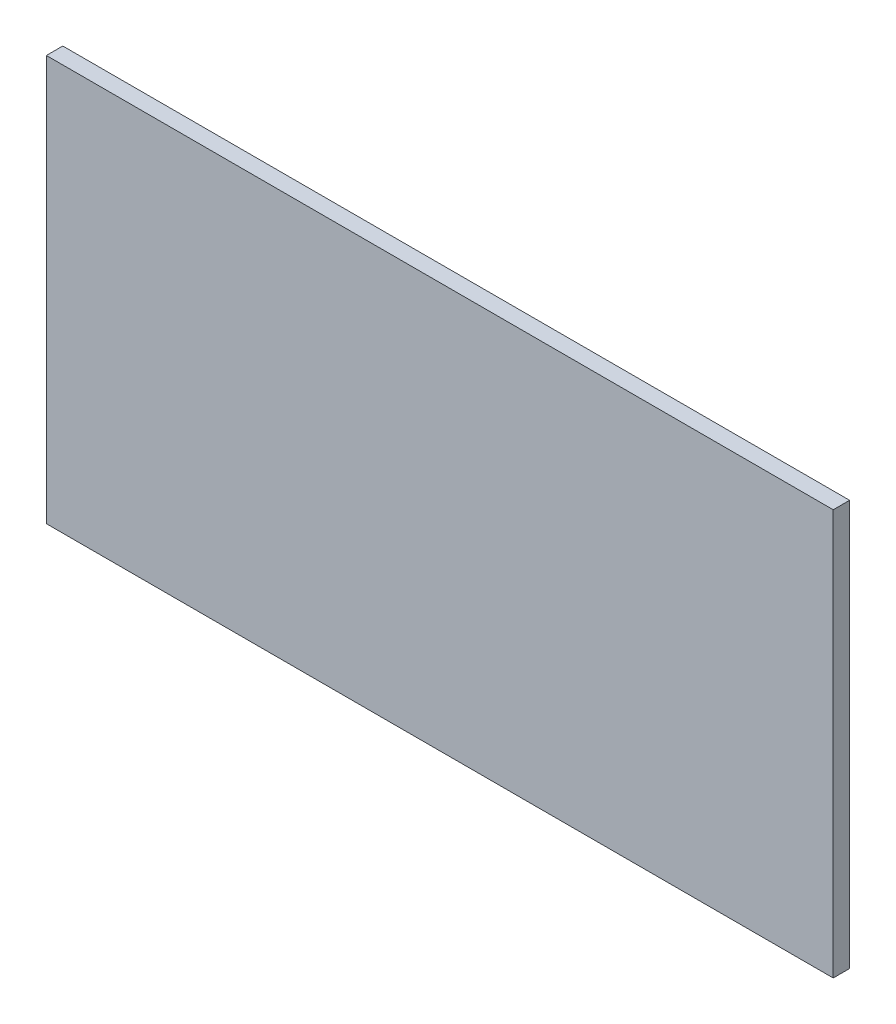
ISO-10303-21;
HEADER;
FILE_DESCRIPTION(('STEP AP214'),'2;1');
FILE_NAME('part.step','',(''),(''),'','','');
FILE_SCHEMA(('AUTOMOTIVE_DESIGN { 1 0 10303 214 1 1 1 1 }'));
ENDSEC;
DATA;
#1=APPLICATION_CONTEXT('core data for automotive mechanical design processes');
#2=APPLICATION_PROTOCOL_DEFINITION('international standard','automotive_design',2000,#1);
#3=PRODUCT_CONTEXT('',#1,'mechanical');
#4=PRODUCT('Part','Part','',(#3));
#5=PRODUCT_RELATED_PRODUCT_CATEGORY('part','',(#4));
#6=PRODUCT_DEFINITION_FORMATION('','',#4);
#7=PRODUCT_DEFINITION_CONTEXT('part definition',#1,'design');
#8=PRODUCT_DEFINITION('design','',#6,#7);
#9=PRODUCT_DEFINITION_SHAPE('','',#8);
#10=(LENGTH_UNIT() NAMED_UNIT(*) SI_UNIT(.MILLI.,.METRE.));
#11=(NAMED_UNIT(*) PLANE_ANGLE_UNIT() SI_UNIT($,.RADIAN.));
#12=(NAMED_UNIT(*) SI_UNIT($,.STERADIAN.) SOLID_ANGLE_UNIT());
#13=UNCERTAINTY_MEASURE_WITH_UNIT(LENGTH_MEASURE(1.E-05),#10,'distance_accuracy_value','');
#14=(GEOMETRIC_REPRESENTATION_CONTEXT(3) GLOBAL_UNCERTAINTY_ASSIGNED_CONTEXT((#13)) GLOBAL_UNIT_ASSIGNED_CONTEXT((#10,
#11,#12)) REPRESENTATION_CONTEXT('',''));
#15=CARTESIAN_POINT('',(0.,0.,0.));
#16=DIRECTION('',(0.,0.,1.));
#17=DIRECTION('',(1.,0.,0.));
#18=AXIS2_PLACEMENT_3D('',#15,#16,#17);
#19=CARTESIAN_POINT('',(304.8,-157.090324336033,-12.7));
#20=DIRECTION('',(1.,0.,0.));
#21=DIRECTION('',(0.,0.,-1.));
#22=AXIS2_PLACEMENT_3D('',#19,#20,#21);
#23=PLANE('',#22);
#24=DIRECTION('',(0.,1.,0.));
#25=VECTOR('',#24,1.);
#26=CARTESIAN_POINT('',(304.8,-157.090324336033,0.));
#27=LINE('',#26,#25);
#28=CARTESIAN_POINT('',(304.8,-157.090324336033,0.));
#29=VERTEX_POINT('',#28);
#30=CARTESIAN_POINT('',(304.8,157.090324336033,0.));
#31=VERTEX_POINT('',#30);
#32=EDGE_CURVE('E146',#29,#31,#27,.T.);
#33=ORIENTED_EDGE('',*,*,#32,.F.);
#34=DIRECTION('',(0.,0.,1.));
#35=VECTOR('',#34,1.);
#36=CARTESIAN_POINT('',(304.8,-157.090324336033,-12.7));
#37=LINE('',#36,#35);
#38=CARTESIAN_POINT('',(304.8,-157.090324336033,-12.7));
#39=VERTEX_POINT('',#38);
#40=EDGE_CURVE('E12',#39,#29,#37,.T.);
#41=ORIENTED_EDGE('',*,*,#40,.F.);
#42=DIRECTION('',(0.,1.,0.));
#43=VECTOR('',#42,1.);
#44=CARTESIAN_POINT('',(304.8,-157.090324336033,-12.7));
#45=LINE('',#44,#43);
#46=CARTESIAN_POINT('',(304.8,157.090324336033,-12.7));
#47=VERTEX_POINT('',#46);
#48=EDGE_CURVE('E152',#39,#47,#45,.T.);
#49=ORIENTED_EDGE('',*,*,#48,.T.);
#50=DIRECTION('',(0.,0.,1.));
#51=VECTOR('',#50,1.);
#52=CARTESIAN_POINT('',(304.8,157.090324336033,-12.7));
#53=LINE('',#52,#51);
#54=EDGE_CURVE('E135',#47,#31,#53,.T.);
#55=ORIENTED_EDGE('',*,*,#54,.T.);
#56=EDGE_LOOP('',(#33,#41,#49,#55));
#57=FACE_BOUND('',#56,.T.);
#58=ADVANCED_FACE('F66',(#57),#23,.T.);
#59=CARTESIAN_POINT('',(-304.8,-157.090324336033,-12.7));
#60=DIRECTION('',(0.,-1.,0.));
#61=DIRECTION('',(0.,0.,-1.));
#62=AXIS2_PLACEMENT_3D('',#59,#60,#61);
#63=PLANE('',#62);
#64=DIRECTION('',(1.,0.,0.));
#65=VECTOR('',#64,1.);
#66=CARTESIAN_POINT('',(-304.8,-157.090324336033,0.));
#67=LINE('',#66,#65);
#68=CARTESIAN_POINT('',(-304.8,-157.090324336033,0.));
#69=VERTEX_POINT('',#68);
#70=EDGE_CURVE('E143',#69,#29,#67,.T.);
#71=ORIENTED_EDGE('',*,*,#70,.F.);
#72=DIRECTION('',(0.,0.,1.));
#73=VECTOR('',#72,1.);
#74=CARTESIAN_POINT('',(-304.8,-157.090324336033,-12.7));
#75=LINE('',#74,#73);
#76=CARTESIAN_POINT('',(-304.8,-157.090324336033,-12.7));
#77=VERTEX_POINT('',#76);
#78=EDGE_CURVE('E74',#77,#69,#75,.T.);
#79=ORIENTED_EDGE('',*,*,#78,.F.);
#80=DIRECTION('',(1.,0.,0.));
#81=VECTOR('',#80,1.);
#82=CARTESIAN_POINT('',(-304.8,-157.090324336033,-12.7));
#83=LINE('',#82,#81);
#84=EDGE_CURVE('E69',#77,#39,#83,.T.);
#85=ORIENTED_EDGE('',*,*,#84,.T.);
#86=ORIENTED_EDGE('',*,*,#40,.T.);
#87=EDGE_LOOP('',(#71,#79,#85,#86));
#88=FACE_BOUND('',#87,.T.);
#89=ADVANCED_FACE('F217',(#88),#63,.T.);
#90=CARTESIAN_POINT('',(-304.8,-157.090324336033,-12.7));
#91=DIRECTION('',(-1.,0.,0.));
#92=DIRECTION('',(0.,0.,1.));
#93=AXIS2_PLACEMENT_3D('',#90,#91,#92);
#94=PLANE('',#93);
#95=DIRECTION('',(0.,-1.,0.));
#96=VECTOR('',#95,1.);
#97=CARTESIAN_POINT('',(-304.8,-157.090324336033,0.));
#98=LINE('',#97,#96);
#99=CARTESIAN_POINT('',(-304.8,157.090324336033,0.));
#100=VERTEX_POINT('',#99);
#101=EDGE_CURVE('E138',#100,#69,#98,.T.);
#102=ORIENTED_EDGE('',*,*,#101,.F.);
#103=DIRECTION('',(0.,0.,1.));
#104=VECTOR('',#103,1.);
#105=CARTESIAN_POINT('',(-304.8,157.090324336033,-12.7));
#106=LINE('',#105,#104);
#107=CARTESIAN_POINT('',(-304.8,157.090324336033,-12.7));
#108=VERTEX_POINT('',#107);
#109=EDGE_CURVE('E125',#108,#100,#106,.T.);
#110=ORIENTED_EDGE('',*,*,#109,.F.);
#111=DIRECTION('',(0.,1.,0.));
#112=VECTOR('',#111,1.);
#113=CARTESIAN_POINT('',(-304.8,-157.090324336033,-12.7));
#114=LINE('',#113,#112);
#115=EDGE_CURVE('E156',#108,#77,#114,.F.);
#116=ORIENTED_EDGE('',*,*,#115,.T.);
#117=ORIENTED_EDGE('',*,*,#78,.T.);
#118=EDGE_LOOP('',(#102,#110,#116,#117));
#119=FACE_BOUND('',#118,.T.);
#120=ADVANCED_FACE('F139',(#119),#94,.T.);
#121=CARTESIAN_POINT('',(-304.8,157.090324336033,-12.7));
#122=DIRECTION('',(0.,1.,0.));
#123=DIRECTION('',(0.,0.,1.));
#124=AXIS2_PLACEMENT_3D('',#121,#122,#123);
#125=PLANE('',#124);
#126=DIRECTION('',(-1.,0.,0.));
#127=VECTOR('',#126,1.);
#128=CARTESIAN_POINT('',(-304.8,157.090324336033,0.));
#129=LINE('',#128,#127);
#130=EDGE_CURVE('E130',#31,#100,#129,.T.);
#131=ORIENTED_EDGE('',*,*,#130,.F.);
#132=ORIENTED_EDGE('',*,*,#54,.F.);
#133=DIRECTION('',(1.,0.,0.));
#134=VECTOR('',#133,1.);
#135=CARTESIAN_POINT('',(-304.8,157.090324336033,-12.7));
#136=LINE('',#135,#134);
#137=EDGE_CURVE('E132',#47,#108,#136,.F.);
#138=ORIENTED_EDGE('',*,*,#137,.T.);
#139=ORIENTED_EDGE('',*,*,#109,.T.);
#140=EDGE_LOOP('',(#131,#132,#138,#139));
#141=FACE_BOUND('',#140,.T.);
#142=ADVANCED_FACE('F127',(#141),#125,.T.);
#143=CARTESIAN_POINT('',(0.,0.,0.));
#144=DIRECTION('',(0.,0.,-1.));
#145=DIRECTION('',(-1.,0.,0.));
#146=AXIS2_PLACEMENT_3D('',#143,#144,#145);
#147=PLANE('',#146);
#148=ORIENTED_EDGE('',*,*,#32,.T.);
#149=ORIENTED_EDGE('',*,*,#130,.T.);
#150=ORIENTED_EDGE('',*,*,#101,.T.);
#151=ORIENTED_EDGE('',*,*,#70,.T.);
#152=EDGE_LOOP('',(#148,#149,#150,#151));
#153=FACE_BOUND('',#152,.T.);
#154=ADVANCED_FACE('F145',(#153),#147,.F.);
#155=CARTESIAN_POINT('',(0.,0.,-38.1));
#156=DIRECTION('',(0.,0.,1.));
#157=DIRECTION('',(1.,0.,0.));
#158=AXIS2_PLACEMENT_3D('',#155,#156,#157);
#159=PLANE('',#158);
#160=CARTESIAN_POINT('',(0.,0.,-38.1));
#161=DIRECTION('',(0.,0.,1.));
#162=DIRECTION('',(1.,0.,0.));
#163=AXIS2_PLACEMENT_3D('',#160,#161,#162);
#164=CIRCLE('',#163,88.9);
#165=CARTESIAN_POINT('',(-79.0222222222222,40.7271211241567,-38.1));
#166=VERTEX_POINT('',#165);
#167=CARTESIAN_POINT('',(-79.0222222222222,-40.7271211241566,-38.1));
#168=VERTEX_POINT('',#167);
#169=EDGE_CURVE('E165',#166,#168,#164,.T.);
#170=ORIENTED_EDGE('',*,*,#169,.F.);
#171=CARTESIAN_POINT('',(79.0222222222222,40.7271211241566,-38.1));
#172=VERTEX_POINT('',#171);
#173=EDGE_CURVE('E286',#172,#166,#164,.T.);
#174=ORIENTED_EDGE('',*,*,#173,.F.);
#175=CARTESIAN_POINT('',(79.0222222222222,-40.7271211241567,-38.1));
#176=VERTEX_POINT('',#175);
#177=EDGE_CURVE('E113',#176,#172,#164,.T.);
#178=ORIENTED_EDGE('',*,*,#177,.F.);
#179=EDGE_CURVE('E170',#168,#176,#164,.T.);
#180=ORIENTED_EDGE('',*,*,#179,.F.);
#181=EDGE_LOOP('',(#170,#174,#178,#180));
#182=FACE_BOUND('',#181,.T.);
#183=ADVANCED_FACE('F216',(#182),#159,.F.);
#184=CARTESIAN_POINT('',(304.8,157.090324336033,-12.7));
#185=CARTESIAN_POINT('',(79.0222222222222,40.7271211241566,-38.1));
#186=CARTESIAN_POINT('',(304.8,143.999463974697,-12.7));
#187=CARTESIAN_POINT('',(80.5770576131687,37.7102973371821,-38.1));
#188=CARTESIAN_POINT('',(304.8,130.908603613361,-12.7));
#189=CARTESIAN_POINT('',(81.9803890528236,34.5619094526094,-38.1));
#190=CARTESIAN_POINT('',(304.8,104.726882890689,-12.7));
#191=CARTESIAN_POINT('',(84.4302871037601,28.0506041617524,-38.1));
#192=CARTESIAN_POINT('',(304.8,91.6360225293526,-12.7));
#193=CARTESIAN_POINT('',(85.4766995729188,24.6877697047503,-38.1));
#194=CARTESIAN_POINT('',(304.8,65.4543018066805,-12.7));
#195=CARTESIAN_POINT('',(87.1696772386753,17.8100958161088,-38.1));
#196=CARTESIAN_POINT('',(304.8,52.3634414453445,-12.7));
#197=CARTESIAN_POINT('',(87.8161203468896,14.2953949282553,-38.1));
#198=CARTESIAN_POINT('',(304.8,26.1817207226723,-12.7));
#199=CARTESIAN_POINT('',(88.6813155505463,7.18704258778338,-38.1));
#200=CARTESIAN_POINT('',(304.8,13.0908603613363,-12.7));
#201=CARTESIAN_POINT('',(88.9,3.59356951095499,-38.1));
#202=CARTESIAN_POINT('',(304.8,-13.0908603613359,-12.7));
#203=CARTESIAN_POINT('',(88.9,-3.59356951095501,-38.1));
#204=CARTESIAN_POINT('',(304.8,-26.181720722672,-12.7));
#205=CARTESIAN_POINT('',(88.6813155505463,-7.1870425877834,-38.1));
#206=CARTESIAN_POINT('',(304.8,-52.3634414453441,-12.7));
#207=CARTESIAN_POINT('',(87.8161203468896,-14.2953949282553,-38.1));
#208=CARTESIAN_POINT('',(304.8,-65.4543018066802,-12.7));
#209=CARTESIAN_POINT('',(87.1696772386753,-17.8100958161088,-38.1));
#210=CARTESIAN_POINT('',(304.8,-91.6360225293523,-12.7));
#211=CARTESIAN_POINT('',(85.4766995729188,-24.6877697047503,-38.1));
#212=CARTESIAN_POINT('',(304.8,-104.726882890688,-12.7));
#213=CARTESIAN_POINT('',(84.4302871037601,-28.0506041617525,-38.1));
#214=CARTESIAN_POINT('',(304.8,-130.908603613361,-12.7));
#215=CARTESIAN_POINT('',(81.9803890528236,-34.5619094526094,-38.1));
#216=CARTESIAN_POINT('',(304.8,-143.999463974697,-12.7));
#217=CARTESIAN_POINT('',(80.5770576131687,-37.7102973371821,-38.1));
#218=CARTESIAN_POINT('',(304.8,-157.090324336033,-12.7));
#219=CARTESIAN_POINT('',(79.0222222222222,-40.7271211241567,-38.1));
#220=B_SPLINE_SURFACE_WITH_KNOTS('',3,1,((#184,#185),(#186,#187),(#188,#189),(#190,#191),(#192,
#193),(#194,#195),(#196,#197),(#198,#199),(#200,#201),(#202,#203),(#204,#205),(#206,#207),(#208,
#209),(#210,#211),(#212,#213),(#214,#215),(#216,#217),(#218,#219)),.UNSPECIFIED.,.F.,.F.,.F.,(4,
2,2,2,2,2,2,2,4),(2,2),(0.,0.125,0.25,0.375,0.5,0.625,0.75,0.875,1.),(0.,1.),.UNSPECIFIED.);
#221=DIRECTION('',(-0.884477502408879,0.455849270739288,-0.0995037190209989));
#222=VECTOR('',#221,1.);
#223=CARTESIAN_POINT('',(191.911111111111,-98.9087227300947,-25.4));
#224=LINE('',#223,#222);
#225=EDGE_CURVE('E82',#39,#176,#224,.T.);
#226=DIRECTION('',(0.884477502408879,0.455849270739288,0.0995037190209989));
#227=VECTOR('',#226,1.);
#228=CARTESIAN_POINT('',(191.911111111111,98.9087227300947,-25.4));
#229=LINE('',#228,#227);
#230=EDGE_CURVE('E161',#172,#47,#229,.T.);
#231=ORIENTED_EDGE('',*,*,#48,.F.);
#232=ORIENTED_EDGE('',*,*,#225,.T.);
#233=ORIENTED_EDGE('',*,*,#177,.T.);
#234=ORIENTED_EDGE('',*,*,#230,.T.);
#235=EDGE_LOOP('',(#231,#232,#233,#234));
#236=FACE_BOUND('',#235,.T.);
#237=ADVANCED_FACE('F160',(#236),#220,.T.);
#238=CARTESIAN_POINT('',(304.8,-157.090324336033,-12.7));
#239=CARTESIAN_POINT('',(79.0222222222222,-40.7271211241567,-38.1));
#240=CARTESIAN_POINT('',(292.1,-157.090324336033,-12.7));
#241=CARTESIAN_POINT('',(77.5138103287349,-43.6538700953501,-38.1));
#242=CARTESIAN_POINT('',(279.4,-157.090324336033,-12.7));
#243=CARTESIAN_POINT('',(75.7912348898562,-46.5967803665858,-38.1));
#244=CARTESIAN_POINT('',(254.,-157.090324336033,-12.7));
#245=CARTESIAN_POINT('',(71.8746170541651,-52.4367299703015,-38.1));
#246=CARTESIAN_POINT('',(241.3,-157.090324336033,-12.7));
#247=CARTESIAN_POINT('',(69.6802949430808,-55.3337099823452,-38.1));
#248=CARTESIAN_POINT('',(215.9,-157.090324336033,-12.7));
#249=CARTESIAN_POINT('',(64.7929032768019,-60.9839540266784,-38.1));
#250=CARTESIAN_POINT('',(203.2,-157.090324336033,-12.7));
#251=CARTESIAN_POINT('',(62.0995464715573,-63.7370315654863,-38.1));
#252=CARTESIAN_POINT('',(177.8,-157.090324336033,-12.7));
#253=CARTESIAN_POINT('',(56.2118151029588,-68.9854673651173,-38.1));
#254=CARTESIAN_POINT('',(165.1,-157.090324336033,-12.7));
#255=CARTESIAN_POINT('',(53.0172110539105,-71.4804949232376,-38.1));
#256=CARTESIAN_POINT('',(139.7,-157.090324336033,-12.7));
#257=CARTESIAN_POINT('',(46.1577540622526,-76.0903907358511,-38.1));
#258=CARTESIAN_POINT('',(127.,-157.090324336033,-12.7));
#259=CARTESIAN_POINT('',(42.4928099318268,-78.2048055679621,-38.1));
#260=CARTESIAN_POINT('',(101.6,-157.090324336033,-12.7));
#261=CARTESIAN_POINT('',(34.7616086041956,-81.9344925966704,-38.1));
#262=CARTESIAN_POINT('',(88.8999999999997,-157.090324336033,-12.7));
#263=CARTESIAN_POINT('',(30.695467956696,-83.5492604673754,-38.1));
#264=CARTESIAN_POINT('',(63.4999999999997,-157.090324336033,-12.7));
#265=CARTESIAN_POINT('',(22.268836933754,-86.1788232650212,-38.1));
#266=CARTESIAN_POINT('',(50.7999999999997,-157.090324336033,-12.7));
#267=CARTESIAN_POINT('',(17.9086943809375,-87.193176195649,-38.1));
#268=CARTESIAN_POINT('',(25.3999999999996,-157.090324336033,-12.7));
#269=CARTESIAN_POINT('',(9.03211374634244,-88.5538944981441,-38.1));
#270=CARTESIAN_POINT('',(12.6999999999996,-157.090324336033,-12.7));
#271=CARTESIAN_POINT('',(4.5162073946103,-88.8999999999999,-38.1));
#272=CARTESIAN_POINT('',(-12.7000000000004,-157.090324336033,-12.7));
#273=CARTESIAN_POINT('',(-4.51620739461033,-88.8999999999999,-38.1));
#274=CARTESIAN_POINT('',(-25.4000000000003,-157.090324336033,-12.7));
#275=CARTESIAN_POINT('',(-9.03211374634247,-88.5538944981441,-38.1));
#276=CARTESIAN_POINT('',(-50.8000000000003,-157.090324336033,-12.7));
#277=CARTESIAN_POINT('',(-17.9086943809375,-87.1931761956489,-38.1));
#278=CARTESIAN_POINT('',(-63.5000000000003,-157.090324336033,-12.7));
#279=CARTESIAN_POINT('',(-22.268836933754,-86.1788232650212,-38.1));
#280=CARTESIAN_POINT('',(-88.9000000000002,-157.090324336033,-12.7));
#281=CARTESIAN_POINT('',(-30.695467956696,-83.5492604673754,-38.1));
#282=CARTESIAN_POINT('',(-101.6,-157.090324336033,-12.7));
#283=CARTESIAN_POINT('',(-34.7616086041957,-81.9344925966703,-38.1));
#284=CARTESIAN_POINT('',(-127.,-157.090324336033,-12.7));
#285=CARTESIAN_POINT('',(-42.4928099318268,-78.2048055679621,-38.1));
#286=CARTESIAN_POINT('',(-139.7,-157.090324336033,-12.7));
#287=CARTESIAN_POINT('',(-46.1577540622526,-76.0903907358511,-38.1));
#288=CARTESIAN_POINT('',(-165.1,-157.090324336033,-12.7));
#289=CARTESIAN_POINT('',(-53.0172110539105,-71.4804949232376,-38.1));
#290=CARTESIAN_POINT('',(-177.8,-157.090324336033,-12.7));
#291=CARTESIAN_POINT('',(-56.2118151029589,-68.9854673651173,-38.1));
#292=CARTESIAN_POINT('',(-203.2,-157.090324336033,-12.7));
#293=CARTESIAN_POINT('',(-62.0995464715573,-63.7370315654863,-38.1));
#294=CARTESIAN_POINT('',(-215.9,-157.090324336033,-12.7));
#295=CARTESIAN_POINT('',(-64.7929032768019,-60.9839540266784,-38.1));
#296=CARTESIAN_POINT('',(-241.3,-157.090324336033,-12.7));
#297=CARTESIAN_POINT('',(-69.6802949430809,-55.3337099823452,-38.1));
#298=CARTESIAN_POINT('',(-254.,-157.090324336033,-12.7));
#299=CARTESIAN_POINT('',(-71.8746170541651,-52.4367299703015,-38.1));
#300=CARTESIAN_POINT('',(-279.4,-157.090324336033,-12.7));
#301=CARTESIAN_POINT('',(-75.7912348898562,-46.5967803665858,-38.1));
#302=CARTESIAN_POINT('',(-292.1,-157.090324336033,-12.7));
#303=CARTESIAN_POINT('',(-77.5138103287349,-43.6538700953501,-38.1));
#304=CARTESIAN_POINT('',(-304.8,-157.090324336033,-12.7));
#305=CARTESIAN_POINT('',(-79.0222222222222,-40.7271211241566,-38.1));
#306=B_SPLINE_SURFACE_WITH_KNOTS('',3,1,((#238,#239),(#240,#241),(#242,#243),(#244,#245),(#246,
#247),(#248,#249),(#250,#251),(#252,#253),(#254,#255),(#256,#257),(#258,#259),(#260,#261),(#262,
#263),(#264,#265),(#266,#267),(#268,#269),(#270,#271),(#272,#273),(#274,#275),(#276,#277),(#278,
#279),(#280,#281),(#282,#283),(#284,#285),(#286,#287),(#288,#289),(#290,#291),(#292,#293),(#294,
#295),(#296,#297),(#298,#299),(#300,#301),(#302,#303),(#304,#305)),.UNSPECIFIED.,.F.,.F.,.F.,(4,
2,2,2,2,2,2,2,2,2,2,2,2,2,2,2,4),(2,2),(0.,0.0625,0.125,0.1875,0.25,0.3125,0.375,0.4375,0.5,
0.5625,0.625,0.6875,0.75,0.8125,0.875,0.9375,1.),(0.,1.),.UNSPECIFIED.);
#307=DIRECTION('',(0.884477502408879,0.455849270739288,-0.0995037190209989));
#308=VECTOR('',#307,1.);
#309=CARTESIAN_POINT('',(-191.911111111111,-98.9087227300947,-25.4));
#310=LINE('',#309,#308);
#311=EDGE_CURVE('E167',#77,#168,#310,.T.);
#312=ORIENTED_EDGE('',*,*,#84,.F.);
#313=ORIENTED_EDGE('',*,*,#311,.T.);
#314=ORIENTED_EDGE('',*,*,#179,.T.);
#315=ORIENTED_EDGE('',*,*,#225,.F.);
#316=EDGE_LOOP('',(#312,#313,#314,#315));
#317=FACE_BOUND('',#316,.T.);
#318=ADVANCED_FACE('F260',(#317),#306,.T.);
#319=CARTESIAN_POINT('',(-304.8,157.090324336033,-12.7));
#320=CARTESIAN_POINT('',(-79.0222222222222,40.7271211241566,-38.1));
#321=CARTESIAN_POINT('',(-292.1,157.090324336033,-12.7));
#322=CARTESIAN_POINT('',(-77.5138103287349,43.6538700953501,-38.1));
#323=CARTESIAN_POINT('',(-279.4,157.090324336033,-12.7));
#324=CARTESIAN_POINT('',(-75.7912348898562,46.5967803665858,-38.1));
#325=CARTESIAN_POINT('',(-254.,157.090324336033,-12.7));
#326=CARTESIAN_POINT('',(-71.8746170541651,52.4367299703015,-38.1));
#327=CARTESIAN_POINT('',(-241.3,157.090324336033,-12.7));
#328=CARTESIAN_POINT('',(-69.6802949430808,55.3337099823452,-38.1));
#329=CARTESIAN_POINT('',(-215.9,157.090324336033,-12.7));
#330=CARTESIAN_POINT('',(-64.7929032768019,60.9839540266784,-38.1));
#331=CARTESIAN_POINT('',(-203.2,157.090324336033,-12.7));
#332=CARTESIAN_POINT('',(-62.0995464715573,63.7370315654863,-38.1));
#333=CARTESIAN_POINT('',(-177.8,157.090324336033,-12.7));
#334=CARTESIAN_POINT('',(-56.2118151029589,68.9854673651173,-38.1));
#335=CARTESIAN_POINT('',(-165.1,157.090324336033,-12.7));
#336=CARTESIAN_POINT('',(-53.0172110539105,71.4804949232376,-38.1));
#337=CARTESIAN_POINT('',(-139.7,157.090324336033,-12.7));
#338=CARTESIAN_POINT('',(-46.1577540622526,76.0903907358511,-38.1));
#339=CARTESIAN_POINT('',(-127.,157.090324336033,-12.7));
#340=CARTESIAN_POINT('',(-42.4928099318268,78.2048055679621,-38.1));
#341=CARTESIAN_POINT('',(-101.6,157.090324336033,-12.7));
#342=CARTESIAN_POINT('',(-34.7616086041956,81.9344925966704,-38.1));
#343=CARTESIAN_POINT('',(-88.9,157.090324336033,-12.7));
#344=CARTESIAN_POINT('',(-30.695467956696,83.5492604673754,-38.1));
#345=CARTESIAN_POINT('',(-63.5,157.090324336033,-12.7));
#346=CARTESIAN_POINT('',(-22.268836933754,86.1788232650212,-38.1));
#347=CARTESIAN_POINT('',(-50.8,157.090324336033,-12.7));
#348=CARTESIAN_POINT('',(-17.9086943809375,87.1931761956489,-38.1));
#349=CARTESIAN_POINT('',(-25.4,157.090324336033,-12.7));
#350=CARTESIAN_POINT('',(-9.03211374634245,88.5538944981441,-38.1));
#351=CARTESIAN_POINT('',(-12.7,157.090324336033,-12.7));
#352=CARTESIAN_POINT('',(-4.5162073946103,88.9,-38.1));
#353=CARTESIAN_POINT('',(12.7,157.090324336033,-12.7));
#354=CARTESIAN_POINT('',(4.51620739461032,88.9,-38.1));
#355=CARTESIAN_POINT('',(25.4,157.090324336033,-12.7));
#356=CARTESIAN_POINT('',(9.03211374634246,88.5538944981441,-38.1));
#357=CARTESIAN_POINT('',(50.8,157.090324336033,-12.7));
#358=CARTESIAN_POINT('',(17.9086943809375,87.1931761956489,-38.1));
#359=CARTESIAN_POINT('',(63.5,157.090324336033,-12.7));
#360=CARTESIAN_POINT('',(22.268836933754,86.1788232650212,-38.1));
#361=CARTESIAN_POINT('',(88.9,157.090324336033,-12.7));
#362=CARTESIAN_POINT('',(30.695467956696,83.5492604673754,-38.1));
#363=CARTESIAN_POINT('',(101.6,157.090324336033,-12.7));
#364=CARTESIAN_POINT('',(34.7616086041957,81.9344925966704,-38.1));
#365=CARTESIAN_POINT('',(127.,157.090324336033,-12.7));
#366=CARTESIAN_POINT('',(42.4928099318268,78.2048055679621,-38.1));
#367=CARTESIAN_POINT('',(139.7,157.090324336033,-12.7));
#368=CARTESIAN_POINT('',(46.1577540622526,76.0903907358511,-38.1));
#369=CARTESIAN_POINT('',(165.1,157.090324336033,-12.7));
#370=CARTESIAN_POINT('',(53.0172110539105,71.4804949232376,-38.1));
#371=CARTESIAN_POINT('',(177.8,157.090324336033,-12.7));
#372=CARTESIAN_POINT('',(56.2118151029589,68.9854673651173,-38.1));
#373=CARTESIAN_POINT('',(203.2,157.090324336033,-12.7));
#374=CARTESIAN_POINT('',(62.0995464715573,63.7370315654863,-38.1));
#375=CARTESIAN_POINT('',(215.9,157.090324336033,-12.7));
#376=CARTESIAN_POINT('',(64.7929032768019,60.9839540266784,-38.1));
#377=CARTESIAN_POINT('',(241.3,157.090324336033,-12.7));
#378=CARTESIAN_POINT('',(69.6802949430809,55.3337099823452,-38.1));
#379=CARTESIAN_POINT('',(254.,157.090324336033,-12.7));
#380=CARTESIAN_POINT('',(71.8746170541651,52.4367299703015,-38.1));
#381=CARTESIAN_POINT('',(279.4,157.090324336033,-12.7));
#382=CARTESIAN_POINT('',(75.7912348898562,46.5967803665858,-38.1));
#383=CARTESIAN_POINT('',(292.1,157.090324336033,-12.7));
#384=CARTESIAN_POINT('',(77.513810328735,43.6538700953501,-38.1));
#385=CARTESIAN_POINT('',(304.8,157.090324336033,-12.7));
#386=CARTESIAN_POINT('',(79.0222222222222,40.7271211241566,-38.1));
#387=B_SPLINE_SURFACE_WITH_KNOTS('',3,1,((#319,#320),(#321,#322),(#323,#324),(#325,#326),(#327,
#328),(#329,#330),(#331,#332),(#333,#334),(#335,#336),(#337,#338),(#339,#340),(#341,#342),(#343,
#344),(#345,#346),(#347,#348),(#349,#350),(#351,#352),(#353,#354),(#355,#356),(#357,#358),(#359,
#360),(#361,#362),(#363,#364),(#365,#366),(#367,#368),(#369,#370),(#371,#372),(#373,#374),(#375,
#376),(#377,#378),(#379,#380),(#381,#382),(#383,#384),(#385,#386)),.UNSPECIFIED.,.F.,.F.,.F.,(4,
2,2,2,2,2,2,2,2,2,2,2,2,2,2,2,4),(2,2),(0.,0.0625,0.125,0.1875,0.25,0.3125,0.375,0.4375,0.5,
0.5625,0.625,0.6875,0.75,0.8125,0.875,0.9375,1.),(0.,1.),.UNSPECIFIED.);
#388=DIRECTION('',(0.884477502408879,-0.455849270739288,-0.0995037190209989));
#389=VECTOR('',#388,1.);
#390=CARTESIAN_POINT('',(-191.911111111111,98.9087227300947,-25.4));
#391=LINE('',#390,#389);
#392=EDGE_CURVE('E148',#108,#166,#391,.T.);
#393=ORIENTED_EDGE('',*,*,#137,.F.);
#394=ORIENTED_EDGE('',*,*,#230,.F.);
#395=ORIENTED_EDGE('',*,*,#173,.T.);
#396=ORIENTED_EDGE('',*,*,#392,.F.);
#397=EDGE_LOOP('',(#393,#394,#395,#396));
#398=FACE_BOUND('',#397,.T.);
#399=ADVANCED_FACE('F205',(#398),#387,.T.);
#400=CARTESIAN_POINT('',(-304.8,-157.090324336033,-12.7));
#401=CARTESIAN_POINT('',(-79.0222222222222,-40.7271211241566,-38.1));
#402=CARTESIAN_POINT('',(-304.8,-143.999463974697,-12.7));
#403=CARTESIAN_POINT('',(-80.5770576131687,-37.7102973371821,-38.1));
#404=CARTESIAN_POINT('',(-304.8,-130.908603613361,-12.7));
#405=CARTESIAN_POINT('',(-81.9803890528236,-34.5619094526094,-38.1));
#406=CARTESIAN_POINT('',(-304.8,-104.726882890689,-12.7));
#407=CARTESIAN_POINT('',(-84.4302871037601,-28.0506041617524,-38.1));
#408=CARTESIAN_POINT('',(-304.8,-91.6360225293525,-12.7));
#409=CARTESIAN_POINT('',(-85.4766995729188,-24.6877697047503,-38.1));
#410=CARTESIAN_POINT('',(-304.8,-65.4543018066803,-12.7));
#411=CARTESIAN_POINT('',(-87.1696772386753,-17.8100958161088,-38.1));
#412=CARTESIAN_POINT('',(-304.8,-52.3634414453443,-12.7));
#413=CARTESIAN_POINT('',(-87.8161203468896,-14.2953949282553,-38.1));
#414=CARTESIAN_POINT('',(-304.8,-26.1817207226722,-12.7));
#415=CARTESIAN_POINT('',(-88.6813155505463,-7.18704258778338,-38.1));
#416=CARTESIAN_POINT('',(-304.8,-13.0908603613361,-12.7));
#417=CARTESIAN_POINT('',(-88.9,-3.59356951095499,-38.1));
#418=CARTESIAN_POINT('',(-304.8,13.090860361336,-12.7));
#419=CARTESIAN_POINT('',(-88.9,3.59356951095501,-38.1));
#420=CARTESIAN_POINT('',(-304.8,26.1817207226721,-12.7));
#421=CARTESIAN_POINT('',(-88.6813155505463,7.1870425877834,-38.1));
#422=CARTESIAN_POINT('',(-304.8,52.3634414453442,-12.7));
#423=CARTESIAN_POINT('',(-87.8161203468896,14.2953949282553,-38.1));
#424=CARTESIAN_POINT('',(-304.8,65.4543018066803,-12.7));
#425=CARTESIAN_POINT('',(-87.1696772386753,17.8100958161088,-38.1));
#426=CARTESIAN_POINT('',(-304.8,91.6360225293525,-12.7));
#427=CARTESIAN_POINT('',(-85.4766995729188,24.6877697047503,-38.1));
#428=CARTESIAN_POINT('',(-304.8,104.726882890689,-12.7));
#429=CARTESIAN_POINT('',(-84.4302871037601,28.0506041617524,-38.1));
#430=CARTESIAN_POINT('',(-304.8,130.908603613361,-12.7));
#431=CARTESIAN_POINT('',(-81.9803890528236,34.5619094526094,-38.1));
#432=CARTESIAN_POINT('',(-304.8,143.999463974697,-12.7));
#433=CARTESIAN_POINT('',(-80.5770576131687,37.7102973371821,-38.1));
#434=CARTESIAN_POINT('',(-304.8,157.090324336033,-12.7));
#435=CARTESIAN_POINT('',(-79.0222222222222,40.7271211241566,-38.1));
#436=B_SPLINE_SURFACE_WITH_KNOTS('',3,1,((#400,#401),(#402,#403),(#404,#405),(#406,#407),(#408,
#409),(#410,#411),(#412,#413),(#414,#415),(#416,#417),(#418,#419),(#420,#421),(#422,#423),(#424,
#425),(#426,#427),(#428,#429),(#430,#431),(#432,#433),(#434,#435)),.UNSPECIFIED.,.F.,.F.,.F.,(4,
2,2,2,2,2,2,2,4),(2,2),(0.,0.125,0.25,0.375,0.5,0.625,0.75,0.875,1.),(0.,1.),.UNSPECIFIED.);
#437=ORIENTED_EDGE('',*,*,#115,.F.);
#438=ORIENTED_EDGE('',*,*,#392,.T.);
#439=ORIENTED_EDGE('',*,*,#169,.T.);
#440=ORIENTED_EDGE('',*,*,#311,.F.);
#441=EDGE_LOOP('',(#437,#438,#439,#440));
#442=FACE_BOUND('',#441,.T.);
#443=ADVANCED_FACE('F193',(#442),#436,.T.);
#444=CLOSED_SHELL('',(#58,#89,#120,#142,#154,#183,#237,#318,#399,#443));
#445=MANIFOLD_SOLID_BREP('B2',#444);
#446=ADVANCED_BREP_SHAPE_REPRESENTATION('',(#18,#445),#14);
#447=SHAPE_DEFINITION_REPRESENTATION(#9,#446);
ENDSEC;
END-ISO-10303-21;
